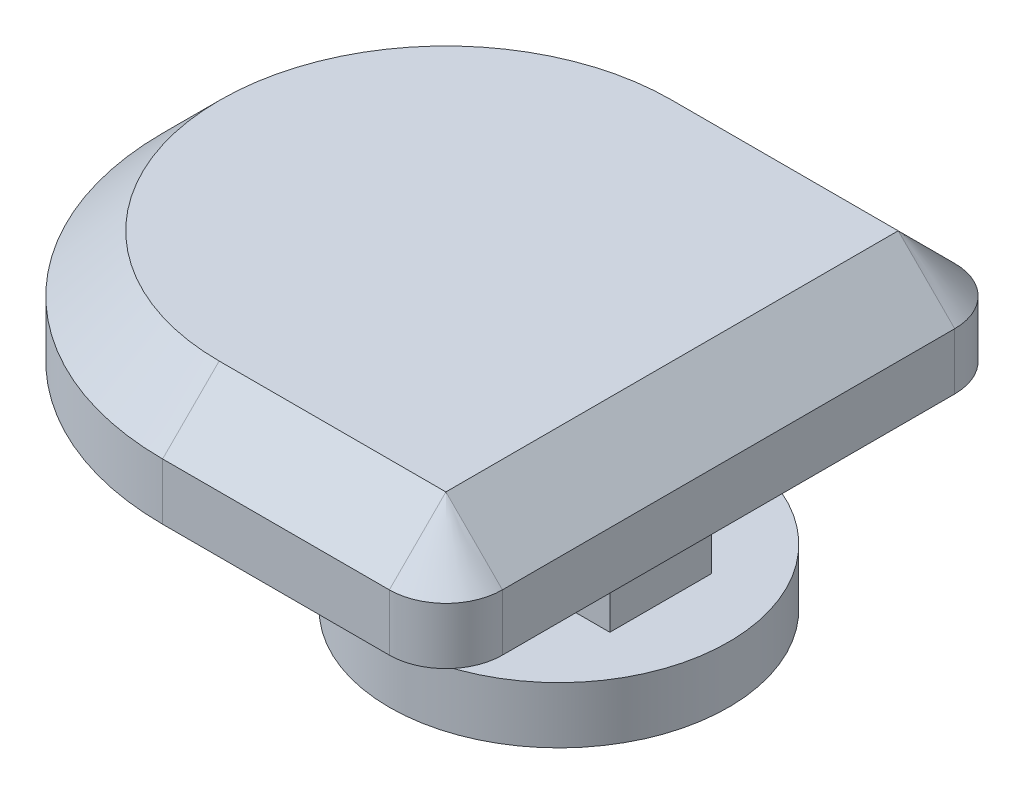
ISO-10303-21;
HEADER;
FILE_DESCRIPTION(('STEP AP214'),'2;1');
FILE_NAME('part.step','',(''),(''),'','','');
FILE_SCHEMA(('AUTOMOTIVE_DESIGN { 1 0 10303 214 1 1 1 1 }'));
ENDSEC;
DATA;
#1=APPLICATION_CONTEXT('core data for automotive mechanical design processes');
#2=APPLICATION_PROTOCOL_DEFINITION('international standard','automotive_design',2000,#1);
#3=PRODUCT_CONTEXT('',#1,'mechanical');
#4=PRODUCT('Part','Part','',(#3));
#5=PRODUCT_RELATED_PRODUCT_CATEGORY('part','',(#4));
#6=PRODUCT_DEFINITION_FORMATION('','',#4);
#7=PRODUCT_DEFINITION_CONTEXT('part definition',#1,'design');
#8=PRODUCT_DEFINITION('design','',#6,#7);
#9=PRODUCT_DEFINITION_SHAPE('','',#8);
#10=(LENGTH_UNIT() NAMED_UNIT(*) SI_UNIT(.MILLI.,.METRE.));
#11=(NAMED_UNIT(*) PLANE_ANGLE_UNIT() SI_UNIT($,.RADIAN.));
#12=(NAMED_UNIT(*) SI_UNIT($,.STERADIAN.) SOLID_ANGLE_UNIT());
#13=UNCERTAINTY_MEASURE_WITH_UNIT(LENGTH_MEASURE(1.E-05),#10,'distance_accuracy_value','');
#14=(GEOMETRIC_REPRESENTATION_CONTEXT(3) GLOBAL_UNCERTAINTY_ASSIGNED_CONTEXT((#13)) GLOBAL_UNIT_ASSIGNED_CONTEXT((#10,
#11,#12)) REPRESENTATION_CONTEXT('',''));
#15=CARTESIAN_POINT('',(0.,0.,0.));
#16=DIRECTION('',(0.,0.,1.));
#17=DIRECTION('',(1.,0.,0.));
#18=AXIS2_PLACEMENT_3D('',#15,#16,#17);
#19=CARTESIAN_POINT('',(0.,1.,0.));
#20=DIRECTION('',(0.,-1.,0.));
#21=DIRECTION('',(0.,0.,-1.));
#22=AXIS2_PLACEMENT_3D('',#19,#20,#21);
#23=CYLINDRICAL_SURFACE('',#22,3.);
#24=CARTESIAN_POINT('',(0.,1.,0.));
#25=DIRECTION('',(0.,1.,0.));
#26=DIRECTION('',(0.,0.,1.));
#27=AXIS2_PLACEMENT_3D('',#24,#25,#26);
#28=CIRCLE('',#27,3.);
#29=CARTESIAN_POINT('',(0.,1.,3.));
#30=VERTEX_POINT('',#29);
#31=EDGE_CURVE('E266',#30,#30,#28,.T.);
#32=ORIENTED_EDGE('',*,*,#31,.F.);
#33=EDGE_LOOP('',(#32));
#34=FACE_BOUND('',#33,.T.);
#35=CARTESIAN_POINT('',(0.,0.,0.));
#36=DIRECTION('',(0.,1.,0.));
#37=DIRECTION('',(0.,0.,1.));
#38=AXIS2_PLACEMENT_3D('',#35,#36,#37);
#39=CIRCLE('',#38,3.);
#40=CARTESIAN_POINT('',(0.,0.,3.));
#41=VERTEX_POINT('',#40);
#42=EDGE_CURVE('E265',#41,#41,#39,.T.);
#43=ORIENTED_EDGE('',*,*,#42,.T.);
#44=EDGE_LOOP('',(#43));
#45=FACE_BOUND('',#44,.T.);
#46=ADVANCED_FACE('F41',(#34,#45),#23,.T.);
#47=CARTESIAN_POINT('',(0.,1.,0.));
#48=DIRECTION('',(0.,1.,0.));
#49=DIRECTION('',(0.,0.,1.));
#50=AXIS2_PLACEMENT_3D('',#47,#48,#49);
#51=PLANE('',#50);
#52=DIRECTION('',(0.,0.,-1.));
#53=VECTOR('',#52,1.);
#54=CARTESIAN_POINT('',(1.8,1.,-0.9));
#55=LINE('',#54,#53);
#56=CARTESIAN_POINT('',(1.8,1.,0.9));
#57=VERTEX_POINT('',#56);
#58=CARTESIAN_POINT('',(1.8,1.,-0.9));
#59=VERTEX_POINT('',#58);
#60=EDGE_CURVE('E155',#57,#59,#55,.T.);
#61=ORIENTED_EDGE('',*,*,#60,.F.);
#62=DIRECTION('',(1.,0.,0.));
#63=VECTOR('',#62,1.);
#64=CARTESIAN_POINT('',(-1.8,1.,0.9));
#65=LINE('',#64,#63);
#66=CARTESIAN_POINT('',(-1.8,1.,0.9));
#67=VERTEX_POINT('',#66);
#68=EDGE_CURVE('E223',#67,#57,#65,.T.);
#69=ORIENTED_EDGE('',*,*,#68,.F.);
#70=DIRECTION('',(0.,0.,1.));
#71=VECTOR('',#70,1.);
#72=CARTESIAN_POINT('',(-1.8,1.,-0.9));
#73=LINE('',#72,#71);
#74=CARTESIAN_POINT('',(-1.8,1.,-0.9));
#75=VERTEX_POINT('',#74);
#76=EDGE_CURVE('E243',#75,#67,#73,.T.);
#77=ORIENTED_EDGE('',*,*,#76,.F.);
#78=DIRECTION('',(-1.,0.,0.));
#79=VECTOR('',#78,1.);
#80=CARTESIAN_POINT('',(-1.8,1.,-0.9));
#81=LINE('',#80,#79);
#82=EDGE_CURVE('E239',#59,#75,#81,.T.);
#83=ORIENTED_EDGE('',*,*,#82,.F.);
#84=EDGE_LOOP('',(#61,#69,#77,#83));
#85=FACE_BOUND('',#84,.T.);
#86=ORIENTED_EDGE('',*,*,#31,.T.);
#87=EDGE_LOOP('',(#86));
#88=FACE_BOUND('',#87,.T.);
#89=ADVANCED_FACE('F378',(#85,#88),#51,.T.);
#90=CARTESIAN_POINT('',(0.,0.,0.));
#91=DIRECTION('',(0.,1.,0.));
#92=DIRECTION('',(0.,0.,1.));
#93=AXIS2_PLACEMENT_3D('',#90,#91,#92);
#94=PLANE('',#93);
#95=ORIENTED_EDGE('',*,*,#42,.F.);
#96=EDGE_LOOP('',(#95));
#97=FACE_BOUND('',#96,.T.);
#98=ADVANCED_FACE('F384',(#97),#94,.F.);
#99=CARTESIAN_POINT('',(1.8,2.8,-0.9));
#100=DIRECTION('',(-1.,0.,0.));
#101=DIRECTION('',(0.,0.,1.));
#102=AXIS2_PLACEMENT_3D('',#99,#100,#101);
#103=PLANE('',#102);
#104=ORIENTED_EDGE('',*,*,#60,.T.);
#105=DIRECTION('',(0.,-1.,0.));
#106=VECTOR('',#105,1.);
#107=CARTESIAN_POINT('',(1.8,2.8,-0.9));
#108=LINE('',#107,#106);
#109=CARTESIAN_POINT('',(1.8,2.8,-0.9));
#110=VERTEX_POINT('',#109);
#111=EDGE_CURVE('E261',#110,#59,#108,.T.);
#112=ORIENTED_EDGE('',*,*,#111,.F.);
#113=DIRECTION('',(0.,0.,-1.));
#114=VECTOR('',#113,1.);
#115=CARTESIAN_POINT('',(1.8,2.8,-0.9));
#116=LINE('',#115,#114);
#117=CARTESIAN_POINT('',(1.8,2.8,0.9));
#118=VERTEX_POINT('',#117);
#119=EDGE_CURVE('E218',#118,#110,#116,.T.);
#120=ORIENTED_EDGE('',*,*,#119,.F.);
#121=DIRECTION('',(0.,-1.,0.));
#122=VECTOR('',#121,1.);
#123=CARTESIAN_POINT('',(1.8,2.8,0.9));
#124=LINE('',#123,#122);
#125=EDGE_CURVE('E235',#118,#57,#124,.T.);
#126=ORIENTED_EDGE('',*,*,#125,.T.);
#127=EDGE_LOOP('',(#104,#112,#120,#126));
#128=FACE_BOUND('',#127,.T.);
#129=ADVANCED_FACE('F475',(#128),#103,.F.);
#130=CARTESIAN_POINT('',(-1.8,2.8,-0.9));
#131=DIRECTION('',(0.,0.,1.));
#132=DIRECTION('',(1.,0.,0.));
#133=AXIS2_PLACEMENT_3D('',#130,#131,#132);
#134=PLANE('',#133);
#135=ORIENTED_EDGE('',*,*,#82,.T.);
#136=DIRECTION('',(0.,-1.,0.));
#137=VECTOR('',#136,1.);
#138=CARTESIAN_POINT('',(-1.8,2.8,-0.9));
#139=LINE('',#138,#137);
#140=CARTESIAN_POINT('',(-1.8,2.8,-0.9));
#141=VERTEX_POINT('',#140);
#142=EDGE_CURVE('E257',#141,#75,#139,.T.);
#143=ORIENTED_EDGE('',*,*,#142,.F.);
#144=DIRECTION('',(-1.,0.,0.));
#145=VECTOR('',#144,1.);
#146=CARTESIAN_POINT('',(-1.8,2.8,-0.9));
#147=LINE('',#146,#145);
#148=EDGE_CURVE('E222',#110,#141,#147,.T.);
#149=ORIENTED_EDGE('',*,*,#148,.F.);
#150=ORIENTED_EDGE('',*,*,#111,.T.);
#151=EDGE_LOOP('',(#135,#143,#149,#150));
#152=FACE_BOUND('',#151,.T.);
#153=ADVANCED_FACE('F471',(#152),#134,.F.);
#154=CARTESIAN_POINT('',(-1.8,2.8,-0.9));
#155=DIRECTION('',(1.,0.,0.));
#156=DIRECTION('',(0.,0.,-1.));
#157=AXIS2_PLACEMENT_3D('',#154,#155,#156);
#158=PLANE('',#157);
#159=ORIENTED_EDGE('',*,*,#76,.T.);
#160=DIRECTION('',(0.,-1.,0.));
#161=VECTOR('',#160,1.);
#162=CARTESIAN_POINT('',(-1.8,2.8,0.9));
#163=LINE('',#162,#161);
#164=CARTESIAN_POINT('',(-1.8,2.8,0.9));
#165=VERTEX_POINT('',#164);
#166=EDGE_CURVE('E253',#165,#67,#163,.T.);
#167=ORIENTED_EDGE('',*,*,#166,.F.);
#168=DIRECTION('',(0.,0.,1.));
#169=VECTOR('',#168,1.);
#170=CARTESIAN_POINT('',(-1.8,2.8,-0.9));
#171=LINE('',#170,#169);
#172=EDGE_CURVE('E227',#141,#165,#171,.T.);
#173=ORIENTED_EDGE('',*,*,#172,.F.);
#174=ORIENTED_EDGE('',*,*,#142,.T.);
#175=EDGE_LOOP('',(#159,#167,#173,#174));
#176=FACE_BOUND('',#175,.T.);
#177=ADVANCED_FACE('F467',(#176),#158,.F.);
#178=CARTESIAN_POINT('',(-1.8,2.8,0.9));
#179=DIRECTION('',(0.,0.,-1.));
#180=DIRECTION('',(-1.,0.,0.));
#181=AXIS2_PLACEMENT_3D('',#178,#179,#180);
#182=PLANE('',#181);
#183=ORIENTED_EDGE('',*,*,#68,.T.);
#184=ORIENTED_EDGE('',*,*,#125,.F.);
#185=DIRECTION('',(1.,0.,0.));
#186=VECTOR('',#185,1.);
#187=CARTESIAN_POINT('',(-1.8,2.8,0.9));
#188=LINE('',#187,#186);
#189=EDGE_CURVE('E231',#165,#118,#188,.T.);
#190=ORIENTED_EDGE('',*,*,#189,.F.);
#191=ORIENTED_EDGE('',*,*,#166,.T.);
#192=EDGE_LOOP('',(#183,#184,#190,#191));
#193=FACE_BOUND('',#192,.T.);
#194=ADVANCED_FACE('F464',(#193),#182,.F.);
#195=CARTESIAN_POINT('',(-2.01,2.8,0.0100000000000005));
#196=DIRECTION('',(0.,1.,0.));
#197=DIRECTION('',(0.,0.,1.));
#198=AXIS2_PLACEMENT_3D('',#195,#196,#197);
#199=PLANE('',#198);
#200=CARTESIAN_POINT('',(-2.01,2.8,0.0100000000000005));
#201=DIRECTION('',(0.,1.,0.));
#202=DIRECTION('',(0.,0.,1.));
#203=AXIS2_PLACEMENT_3D('',#200,#201,#202);
#204=CIRCLE('',#203,4.99);
#205=CARTESIAN_POINT('',(-7.,2.8,0.0099999999999649));
#206=VERTEX_POINT('',#205);
#207=CARTESIAN_POINT('',(-2.00999999999996,2.8,5.));
#208=VERTEX_POINT('',#207);
#209=EDGE_CURVE('E163',#206,#208,#204,.T.);
#210=ORIENTED_EDGE('',*,*,#209,.F.);
#211=DIRECTION('',(0.,0.,1.));
#212=VECTOR('',#211,1.);
#213=CARTESIAN_POINT('',(-7.,2.8,-0.00999999999995796));
#214=LINE('',#213,#212);
#215=CARTESIAN_POINT('',(-7.,2.8,-0.00999999999995796));
#216=VERTEX_POINT('',#215);
#217=EDGE_CURVE('E196',#216,#206,#214,.T.);
#218=ORIENTED_EDGE('',*,*,#217,.F.);
#219=CARTESIAN_POINT('',(-2.01,2.8,-0.00999999999999699));
#220=DIRECTION('',(0.,1.,0.));
#221=DIRECTION('',(0.,0.,1.));
#222=AXIS2_PLACEMENT_3D('',#219,#220,#221);
#223=CIRCLE('',#222,4.99);
#224=CARTESIAN_POINT('',(-2.00999999999997,2.8,-5.));
#225=VERTEX_POINT('',#224);
#226=EDGE_CURVE('E192',#225,#216,#223,.T.);
#227=ORIENTED_EDGE('',*,*,#226,.F.);
#228=DIRECTION('',(-1.,0.,0.));
#229=VECTOR('',#228,1.);
#230=CARTESIAN_POINT('',(1.99999999999999,2.8,-5.));
#231=LINE('',#230,#229);
#232=CARTESIAN_POINT('',(1.99999999999999,2.8,-5.));
#233=VERTEX_POINT('',#232);
#234=EDGE_CURVE('E188',#233,#225,#231,.T.);
#235=ORIENTED_EDGE('',*,*,#234,.F.);
#236=CARTESIAN_POINT('',(2.,2.8,-4.));
#237=DIRECTION('',(0.,1.,0.));
#238=DIRECTION('',(0.,0.,1.));
#239=AXIS2_PLACEMENT_3D('',#236,#237,#238);
#240=CIRCLE('',#239,1.);
#241=CARTESIAN_POINT('',(3.,2.8,-3.99999999999999));
#242=VERTEX_POINT('',#241);
#243=EDGE_CURVE('E184',#242,#233,#240,.T.);
#244=ORIENTED_EDGE('',*,*,#243,.F.);
#245=DIRECTION('',(0.,0.,-1.));
#246=VECTOR('',#245,1.);
#247=CARTESIAN_POINT('',(3.,2.8,-3.99999999999999));
#248=LINE('',#247,#246);
#249=CARTESIAN_POINT('',(3.,2.8,3.99999999999999));
#250=VERTEX_POINT('',#249);
#251=EDGE_CURVE('E180',#250,#242,#248,.T.);
#252=ORIENTED_EDGE('',*,*,#251,.F.);
#253=CARTESIAN_POINT('',(2.,2.8,4.));
#254=DIRECTION('',(0.,1.,0.));
#255=DIRECTION('',(0.,0.,-1.));
#256=AXIS2_PLACEMENT_3D('',#253,#254,#255);
#257=CIRCLE('',#256,1.);
#258=CARTESIAN_POINT('',(1.99999999999999,2.8,5.));
#259=VERTEX_POINT('',#258);
#260=EDGE_CURVE('E166',#259,#250,#257,.T.);
#261=ORIENTED_EDGE('',*,*,#260,.F.);
#262=DIRECTION('',(1.,0.,0.));
#263=VECTOR('',#262,1.);
#264=CARTESIAN_POINT('',(1.99999999999999,2.8,5.));
#265=LINE('',#264,#263);
#266=EDGE_CURVE('E151',#208,#259,#265,.T.);
#267=ORIENTED_EDGE('',*,*,#266,.F.);
#268=EDGE_LOOP('',(#210,#218,#227,#235,#244,#252,#261,#267));
#269=FACE_BOUND('',#268,.T.);
#270=ORIENTED_EDGE('',*,*,#189,.T.);
#271=ORIENTED_EDGE('',*,*,#119,.T.);
#272=ORIENTED_EDGE('',*,*,#148,.T.);
#273=ORIENTED_EDGE('',*,*,#172,.T.);
#274=EDGE_LOOP('',(#270,#271,#272,#273));
#275=FACE_BOUND('',#274,.T.);
#276=ADVANCED_FACE('F160',(#269,#275),#199,.F.);
#277=CARTESIAN_POINT('',(-2.01,4.8,0.0100000000000005));
#278=DIRECTION('',(0.,-1.,0.));
#279=DIRECTION('',(0.,0.,-1.));
#280=AXIS2_PLACEMENT_3D('',#277,#278,#279);
#281=CYLINDRICAL_SURFACE('',#280,4.99);
#282=DIRECTION('',(0.,-1.,0.));
#283=VECTOR('',#282,1.);
#284=CARTESIAN_POINT('',(-2.00999999999996,4.8,5.));
#285=LINE('',#284,#283);
#286=CARTESIAN_POINT('',(-2.00999999999996,3.79999999999999,5.));
#287=VERTEX_POINT('',#286);
#288=EDGE_CURVE('E148',#287,#208,#285,.T.);
#289=ORIENTED_EDGE('',*,*,#288,.F.);
#290=CARTESIAN_POINT('',(-2.01,3.79999999999999,0.0100000000000005));
#291=DIRECTION('',(0.,1.,0.));
#292=DIRECTION('',(0.,0.,1.));
#293=AXIS2_PLACEMENT_3D('',#290,#291,#292);
#294=CIRCLE('',#293,4.99);
#295=CARTESIAN_POINT('',(-7.,3.79999999999999,0.0099999999999649));
#296=VERTEX_POINT('',#295);
#297=EDGE_CURVE('E11',#287,#296,#294,.F.);
#298=ORIENTED_EDGE('',*,*,#297,.T.);
#299=DIRECTION('',(0.,-1.,0.));
#300=VECTOR('',#299,1.);
#301=CARTESIAN_POINT('',(-7.,4.8,0.0099999999999649));
#302=LINE('',#301,#300);
#303=EDGE_CURVE('E170',#296,#206,#302,.T.);
#304=ORIENTED_EDGE('',*,*,#303,.T.);
#305=ORIENTED_EDGE('',*,*,#209,.T.);
#306=EDGE_LOOP('',(#289,#298,#304,#305));
#307=FACE_BOUND('',#306,.T.);
#308=ADVANCED_FACE('F169',(#307),#281,.T.);
#309=CARTESIAN_POINT('',(1.99999999999999,4.8,5.));
#310=DIRECTION('',(0.,0.,-1.));
#311=DIRECTION('',(-1.,0.,0.));
#312=AXIS2_PLACEMENT_3D('',#309,#310,#311);
#313=PLANE('',#312);
#314=DIRECTION('',(0.,-1.,0.));
#315=VECTOR('',#314,1.);
#316=CARTESIAN_POINT('',(1.99999999999999,4.8,5.));
#317=LINE('',#316,#315);
#318=CARTESIAN_POINT('',(1.99999999999999,3.79999999999999,5.));
#319=VERTEX_POINT('',#318);
#320=EDGE_CURVE('E156',#319,#259,#317,.T.);
#321=ORIENTED_EDGE('',*,*,#320,.F.);
#322=DIRECTION('',(-1.,0.,0.));
#323=VECTOR('',#322,1.);
#324=CARTESIAN_POINT('',(-2.00999999999996,3.79999999999999,5.));
#325=LINE('',#324,#323);
#326=EDGE_CURVE('E52',#319,#287,#325,.T.);
#327=ORIENTED_EDGE('',*,*,#326,.T.);
#328=ORIENTED_EDGE('',*,*,#288,.T.);
#329=ORIENTED_EDGE('',*,*,#266,.T.);
#330=EDGE_LOOP('',(#321,#327,#328,#329));
#331=FACE_BOUND('',#330,.T.);
#332=ADVANCED_FACE('F150',(#331),#313,.F.);
#333=CARTESIAN_POINT('',(2.,4.8,4.));
#334=DIRECTION('',(0.,-1.,0.));
#335=DIRECTION('',(0.,0.,-1.));
#336=AXIS2_PLACEMENT_3D('',#333,#334,#335);
#337=CYLINDRICAL_SURFACE('',#336,1.);
#338=DIRECTION('',(0.,-1.,0.));
#339=VECTOR('',#338,1.);
#340=CARTESIAN_POINT('',(3.,4.8,3.99999999999999));
#341=LINE('',#340,#339);
#342=CARTESIAN_POINT('',(3.,3.79999999999999,3.99999999999999));
#343=VERTEX_POINT('',#342);
#344=EDGE_CURVE('E213',#343,#250,#341,.T.);
#345=ORIENTED_EDGE('',*,*,#344,.F.);
#346=CARTESIAN_POINT('',(2.,3.79999999999999,4.));
#347=DIRECTION('',(0.,1.,0.));
#348=DIRECTION('',(0.,0.,1.));
#349=AXIS2_PLACEMENT_3D('',#346,#347,#348);
#350=CIRCLE('',#349,1.);
#351=EDGE_CURVE('E305',#343,#319,#350,.F.);
#352=ORIENTED_EDGE('',*,*,#351,.T.);
#353=ORIENTED_EDGE('',*,*,#320,.T.);
#354=ORIENTED_EDGE('',*,*,#260,.T.);
#355=EDGE_LOOP('',(#345,#352,#353,#354));
#356=FACE_BOUND('',#355,.T.);
#357=ADVANCED_FACE('F451',(#356),#337,.T.);
#358=CARTESIAN_POINT('',(3.,4.8,-3.99999999999999));
#359=DIRECTION('',(-1.,0.,0.));
#360=DIRECTION('',(0.,0.,1.));
#361=AXIS2_PLACEMENT_3D('',#358,#359,#360);
#362=PLANE('',#361);
#363=DIRECTION('',(0.,-1.,0.));
#364=VECTOR('',#363,1.);
#365=CARTESIAN_POINT('',(3.,4.8,-3.99999999999999));
#366=LINE('',#365,#364);
#367=CARTESIAN_POINT('',(3.,3.79999999999999,-3.99999999999999));
#368=VERTEX_POINT('',#367);
#369=EDGE_CURVE('E210',#368,#242,#366,.T.);
#370=ORIENTED_EDGE('',*,*,#369,.F.);
#371=DIRECTION('',(0.,0.,1.));
#372=VECTOR('',#371,1.);
#373=CARTESIAN_POINT('',(3.,3.79999999999999,3.99999999999999));
#374=LINE('',#373,#372);
#375=EDGE_CURVE('E299',#368,#343,#374,.T.);
#376=ORIENTED_EDGE('',*,*,#375,.T.);
#377=ORIENTED_EDGE('',*,*,#344,.T.);
#378=ORIENTED_EDGE('',*,*,#251,.T.);
#379=EDGE_LOOP('',(#370,#376,#377,#378));
#380=FACE_BOUND('',#379,.T.);
#381=ADVANCED_FACE('F448',(#380),#362,.F.);
#382=CARTESIAN_POINT('',(2.,4.8,-4.));
#383=DIRECTION('',(0.,-1.,0.));
#384=DIRECTION('',(0.,0.,-1.));
#385=AXIS2_PLACEMENT_3D('',#382,#383,#384);
#386=CYLINDRICAL_SURFACE('',#385,1.);
#387=DIRECTION('',(0.,-1.,0.));
#388=VECTOR('',#387,1.);
#389=CARTESIAN_POINT('',(1.99999999999999,4.8,-5.));
#390=LINE('',#389,#388);
#391=CARTESIAN_POINT('',(1.99999999999999,3.79999999999999,-5.));
#392=VERTEX_POINT('',#391);
#393=EDGE_CURVE('E207',#392,#233,#390,.T.);
#394=ORIENTED_EDGE('',*,*,#393,.F.);
#395=CARTESIAN_POINT('',(2.,3.79999999999999,-4.));
#396=DIRECTION('',(0.,1.,0.));
#397=DIRECTION('',(0.,0.,1.));
#398=AXIS2_PLACEMENT_3D('',#395,#396,#397);
#399=CIRCLE('',#398,1.);
#400=EDGE_CURVE('E270',#392,#368,#399,.F.);
#401=ORIENTED_EDGE('',*,*,#400,.T.);
#402=ORIENTED_EDGE('',*,*,#369,.T.);
#403=ORIENTED_EDGE('',*,*,#243,.T.);
#404=EDGE_LOOP('',(#394,#401,#402,#403));
#405=FACE_BOUND('',#404,.T.);
#406=ADVANCED_FACE('F446',(#405),#386,.T.);
#407=CARTESIAN_POINT('',(1.99999999999999,4.8,-5.));
#408=DIRECTION('',(0.,0.,1.));
#409=DIRECTION('',(1.,0.,0.));
#410=AXIS2_PLACEMENT_3D('',#407,#408,#409);
#411=PLANE('',#410);
#412=DIRECTION('',(0.,-1.,0.));
#413=VECTOR('',#412,1.);
#414=CARTESIAN_POINT('',(-2.00999999999997,4.8,-5.));
#415=LINE('',#414,#413);
#416=CARTESIAN_POINT('',(-2.00999999999997,3.79999999999999,-5.));
#417=VERTEX_POINT('',#416);
#418=EDGE_CURVE('E204',#417,#225,#415,.T.);
#419=ORIENTED_EDGE('',*,*,#418,.F.);
#420=DIRECTION('',(1.,0.,0.));
#421=VECTOR('',#420,1.);
#422=CARTESIAN_POINT('',(1.99999999999999,3.79999999999999,-5.));
#423=LINE('',#422,#421);
#424=EDGE_CURVE('E296',#417,#392,#423,.T.);
#425=ORIENTED_EDGE('',*,*,#424,.T.);
#426=ORIENTED_EDGE('',*,*,#393,.T.);
#427=ORIENTED_EDGE('',*,*,#234,.T.);
#428=EDGE_LOOP('',(#419,#425,#426,#427));
#429=FACE_BOUND('',#428,.T.);
#430=ADVANCED_FACE('F361',(#429),#411,.F.);
#431=CARTESIAN_POINT('',(-2.01,4.8,-0.00999999999999699));
#432=DIRECTION('',(0.,-1.,0.));
#433=DIRECTION('',(0.,0.,-1.));
#434=AXIS2_PLACEMENT_3D('',#431,#432,#433);
#435=CYLINDRICAL_SURFACE('',#434,4.99);
#436=DIRECTION('',(0.,-1.,0.));
#437=VECTOR('',#436,1.);
#438=CARTESIAN_POINT('',(-7.,4.8,-0.00999999999995796));
#439=LINE('',#438,#437);
#440=CARTESIAN_POINT('',(-7.,3.79999999999999,-0.00999999999995796));
#441=VERTEX_POINT('',#440);
#442=EDGE_CURVE('E201',#441,#216,#439,.T.);
#443=ORIENTED_EDGE('',*,*,#442,.F.);
#444=CARTESIAN_POINT('',(-2.01,3.79999999999999,-0.00999999999999699));
#445=DIRECTION('',(0.,1.,0.));
#446=DIRECTION('',(0.,0.,1.));
#447=AXIS2_PLACEMENT_3D('',#444,#445,#446);
#448=CIRCLE('',#447,4.99);
#449=EDGE_CURVE('E302',#441,#417,#448,.F.);
#450=ORIENTED_EDGE('',*,*,#449,.T.);
#451=ORIENTED_EDGE('',*,*,#418,.T.);
#452=ORIENTED_EDGE('',*,*,#226,.T.);
#453=EDGE_LOOP('',(#443,#450,#451,#452));
#454=FACE_BOUND('',#453,.T.);
#455=ADVANCED_FACE('F359',(#454),#435,.T.);
#456=CARTESIAN_POINT('',(-7.,4.8,-0.00999999999995796));
#457=DIRECTION('',(1.,0.,0.));
#458=DIRECTION('',(0.,0.,-1.));
#459=AXIS2_PLACEMENT_3D('',#456,#457,#458);
#460=PLANE('',#459);
#461=ORIENTED_EDGE('',*,*,#303,.F.);
#462=DIRECTION('',(0.,0.,-1.));
#463=VECTOR('',#462,1.);
#464=CARTESIAN_POINT('',(-7.,3.79999999999999,-0.00999999999995796));
#465=LINE('',#464,#463);
#466=EDGE_CURVE('E308',#296,#441,#465,.T.);
#467=ORIENTED_EDGE('',*,*,#466,.T.);
#468=ORIENTED_EDGE('',*,*,#442,.T.);
#469=ORIENTED_EDGE('',*,*,#217,.T.);
#470=EDGE_LOOP('',(#461,#467,#468,#469));
#471=FACE_BOUND('',#470,.T.);
#472=ADVANCED_FACE('F367',(#471),#460,.F.);
#473=CARTESIAN_POINT('',(-2.01,4.8,0.0100000000000005));
#474=DIRECTION('',(0.,1.,0.));
#475=DIRECTION('',(0.,0.,1.));
#476=AXIS2_PLACEMENT_3D('',#473,#474,#475);
#477=PLANE('',#476);
#478=DIRECTION('',(0.,0.,-1.));
#479=VECTOR('',#478,1.);
#480=CARTESIAN_POINT('',(2.,4.8,-3.99999999999999));
#481=LINE('',#480,#479);
#482=CARTESIAN_POINT('',(2.,4.8,4.));
#483=VERTEX_POINT('',#482);
#484=CARTESIAN_POINT('',(2.,4.8,-4.));
#485=VERTEX_POINT('',#484);
#486=EDGE_CURVE('E289',#483,#485,#481,.T.);
#487=ORIENTED_EDGE('',*,*,#486,.T.);
#488=DIRECTION('',(-1.,0.,0.));
#489=VECTOR('',#488,1.);
#490=CARTESIAN_POINT('',(-2.00999999999997,4.8,-4.));
#491=LINE('',#490,#489);
#492=CARTESIAN_POINT('',(-2.00999999999997,4.8,-4.));
#493=VERTEX_POINT('',#492);
#494=EDGE_CURVE('E292',#485,#493,#491,.T.);
#495=ORIENTED_EDGE('',*,*,#494,.T.);
#496=CARTESIAN_POINT('',(-2.01,4.8,-0.00999999999999699));
#497=DIRECTION('',(0.,1.,0.));
#498=DIRECTION('',(0.,0.,1.));
#499=AXIS2_PLACEMENT_3D('',#496,#497,#498);
#500=CIRCLE('',#499,3.99);
#501=CARTESIAN_POINT('',(-6.,4.8,-0.00999999999996578));
#502=VERTEX_POINT('',#501);
#503=EDGE_CURVE('E286',#493,#502,#500,.T.);
#504=ORIENTED_EDGE('',*,*,#503,.T.);
#505=DIRECTION('',(0.,0.,1.));
#506=VECTOR('',#505,1.);
#507=CARTESIAN_POINT('',(-6.,4.8,0.0099999999999649));
#508=LINE('',#507,#506);
#509=CARTESIAN_POINT('',(-6.,4.8,0.0099999999999649));
#510=VERTEX_POINT('',#509);
#511=EDGE_CURVE('E283',#502,#510,#508,.T.);
#512=ORIENTED_EDGE('',*,*,#511,.T.);
#513=CARTESIAN_POINT('',(-2.01,4.8,0.0100000000000005));
#514=DIRECTION('',(0.,1.,0.));
#515=DIRECTION('',(0.,0.,1.));
#516=AXIS2_PLACEMENT_3D('',#513,#514,#515);
#517=CIRCLE('',#516,3.99);
#518=CARTESIAN_POINT('',(-2.00999999999996,4.8,4.));
#519=VERTEX_POINT('',#518);
#520=EDGE_CURVE('E277',#510,#519,#517,.T.);
#521=ORIENTED_EDGE('',*,*,#520,.T.);
#522=DIRECTION('',(1.,0.,0.));
#523=VECTOR('',#522,1.);
#524=CARTESIAN_POINT('',(1.99999999999999,4.8,4.));
#525=LINE('',#524,#523);
#526=EDGE_CURVE('E280',#519,#483,#525,.T.);
#527=ORIENTED_EDGE('',*,*,#526,.T.);
#528=EDGE_LOOP('',(#487,#495,#504,#512,#521,#527));
#529=FACE_BOUND('',#528,.T.);
#530=ADVANCED_FACE('F347',(#529),#477,.T.);
#531=CARTESIAN_POINT('',(-2.01,4.8,0.0100000000000005));
#532=DIRECTION('',(0.,-1.,0.));
#533=DIRECTION('',(0.,0.,-1.));
#534=AXIS2_PLACEMENT_3D('',#531,#532,#533);
#535=CONICAL_SURFACE('',#534,3.99,0.785398163397445);
#536=DIRECTION('',(0.707106781186545,0.70710678118655,0.));
#537=VECTOR('',#536,1.);
#538=CARTESIAN_POINT('',(-7.,3.79999999999999,0.0099999999999649));
#539=LINE('',#538,#537);
#540=EDGE_CURVE('E176',#296,#510,#539,.T.);
#541=ORIENTED_EDGE('',*,*,#540,.F.);
#542=ORIENTED_EDGE('',*,*,#297,.F.);
#543=DIRECTION('',(0.,-0.70710678118655,0.707106781186545));
#544=VECTOR('',#543,1.);
#545=CARTESIAN_POINT('',(-2.00999999999996,4.8,4.));
#546=LINE('',#545,#544);
#547=EDGE_CURVE('E46',#519,#287,#546,.T.);
#548=ORIENTED_EDGE('',*,*,#547,.F.);
#549=ORIENTED_EDGE('',*,*,#520,.F.);
#550=EDGE_LOOP('',(#541,#542,#548,#549));
#551=FACE_BOUND('',#550,.T.);
#552=ADVANCED_FACE('F44',(#551),#535,.T.);
#553=CARTESIAN_POINT('',(-2.01,4.8,4.));
#554=DIRECTION('',(0.,0.707106781186545,0.70710678118655));
#555=DIRECTION('',(-1.,0.,0.));
#556=AXIS2_PLACEMENT_3D('',#553,#554,#555);
#557=PLANE('',#556);
#558=ORIENTED_EDGE('',*,*,#547,.T.);
#559=ORIENTED_EDGE('',*,*,#326,.F.);
#560=DIRECTION('',(0.,-0.70710678118655,0.707106781186545));
#561=VECTOR('',#560,1.);
#562=CARTESIAN_POINT('',(2.,4.8,4.));
#563=LINE('',#562,#561);
#564=EDGE_CURVE('E331',#483,#319,#563,.T.);
#565=ORIENTED_EDGE('',*,*,#564,.F.);
#566=ORIENTED_EDGE('',*,*,#526,.F.);
#567=EDGE_LOOP('',(#558,#559,#565,#566));
#568=FACE_BOUND('',#567,.T.);
#569=ADVANCED_FACE('F429',(#568),#557,.T.);
#570=CARTESIAN_POINT('',(-6.,4.8,0.0100000000000005));
#571=DIRECTION('',(-0.70710678118655,0.707106781186545,0.));
#572=DIRECTION('',(0.,0.,-1.));
#573=AXIS2_PLACEMENT_3D('',#570,#571,#572);
#574=PLANE('',#573);
#575=ORIENTED_EDGE('',*,*,#540,.T.);
#576=ORIENTED_EDGE('',*,*,#511,.F.);
#577=DIRECTION('',(0.707106781186545,0.70710678118655,0.));
#578=VECTOR('',#577,1.);
#579=CARTESIAN_POINT('',(-7.,3.79999999999999,-0.00999999999995796));
#580=LINE('',#579,#578);
#581=EDGE_CURVE('E327',#441,#502,#580,.T.);
#582=ORIENTED_EDGE('',*,*,#581,.F.);
#583=ORIENTED_EDGE('',*,*,#466,.F.);
#584=EDGE_LOOP('',(#575,#576,#582,#583));
#585=FACE_BOUND('',#584,.T.);
#586=ADVANCED_FACE('F340',(#585),#574,.T.);
#587=CARTESIAN_POINT('',(2.,3.79999999999999,4.));
#588=DIRECTION('',(0.,-1.,0.));
#589=DIRECTION('',(0.,0.,-1.));
#590=AXIS2_PLACEMENT_3D('',#587,#588,#589);
#591=CONICAL_SURFACE('',#590,1.,0.785398163397445);
#592=ORIENTED_EDGE('',*,*,#564,.T.);
#593=ORIENTED_EDGE('',*,*,#351,.F.);
#594=DIRECTION('',(0.707106781186546,-0.70710678118655,0.));
#595=VECTOR('',#594,1.);
#596=CARTESIAN_POINT('',(2.,4.8,3.99999999999999));
#597=LINE('',#596,#595);
#598=EDGE_CURVE('E323',#483,#343,#597,.T.);
#599=ORIENTED_EDGE('',*,*,#598,.F.);
#600=EDGE_LOOP('',(#592,#593,#599));
#601=FACE_BOUND('',#600,.T.);
#602=ADVANCED_FACE('F418',(#601),#591,.T.);
#603=CARTESIAN_POINT('',(-2.01,4.8,-0.00999999999999699));
#604=DIRECTION('',(0.,-1.,0.));
#605=DIRECTION('',(0.,0.,-1.));
#606=AXIS2_PLACEMENT_3D('',#603,#604,#605);
#607=CONICAL_SURFACE('',#606,3.99,0.785398163397445);
#608=ORIENTED_EDGE('',*,*,#581,.T.);
#609=ORIENTED_EDGE('',*,*,#503,.F.);
#610=DIRECTION('',(0.,0.70710678118655,0.707106781186545));
#611=VECTOR('',#610,1.);
#612=CARTESIAN_POINT('',(-2.00999999999997,3.79999999999999,-5.));
#613=LINE('',#612,#611);
#614=EDGE_CURVE('E320',#417,#493,#613,.T.);
#615=ORIENTED_EDGE('',*,*,#614,.F.);
#616=ORIENTED_EDGE('',*,*,#449,.F.);
#617=EDGE_LOOP('',(#608,#609,#615,#616));
#618=FACE_BOUND('',#617,.T.);
#619=ADVANCED_FACE('F353',(#618),#607,.T.);
#620=CARTESIAN_POINT('',(2.,4.8,0.00999999999999937));
#621=DIRECTION('',(0.70710678118655,0.707106781186545,0.));
#622=DIRECTION('',(0.,0.,1.));
#623=AXIS2_PLACEMENT_3D('',#620,#621,#622);
#624=PLANE('',#623);
#625=ORIENTED_EDGE('',*,*,#598,.T.);
#626=ORIENTED_EDGE('',*,*,#375,.F.);
#627=DIRECTION('',(0.707106781186546,-0.70710678118655,0.));
#628=VECTOR('',#627,1.);
#629=CARTESIAN_POINT('',(2.,4.8,-4.));
#630=LINE('',#629,#628);
#631=EDGE_CURVE('E317',#485,#368,#630,.T.);
#632=ORIENTED_EDGE('',*,*,#631,.F.);
#633=ORIENTED_EDGE('',*,*,#486,.F.);
#634=EDGE_LOOP('',(#625,#626,#632,#633));
#635=FACE_BOUND('',#634,.T.);
#636=ADVANCED_FACE('F405',(#635),#624,.T.);
#637=CARTESIAN_POINT('',(-2.01,4.8,-4.));
#638=DIRECTION('',(0.,0.707106781186545,-0.70710678118655));
#639=DIRECTION('',(1.,0.,0.));
#640=AXIS2_PLACEMENT_3D('',#637,#638,#639);
#641=PLANE('',#640);
#642=ORIENTED_EDGE('',*,*,#614,.T.);
#643=ORIENTED_EDGE('',*,*,#494,.F.);
#644=DIRECTION('',(0.,0.70710678118655,0.707106781186545));
#645=VECTOR('',#644,1.);
#646=CARTESIAN_POINT('',(1.99999999999999,3.79999999999999,-5.));
#647=LINE('',#646,#645);
#648=EDGE_CURVE('E313',#392,#485,#647,.T.);
#649=ORIENTED_EDGE('',*,*,#648,.F.);
#650=ORIENTED_EDGE('',*,*,#424,.F.);
#651=EDGE_LOOP('',(#642,#643,#649,#650));
#652=FACE_BOUND('',#651,.T.);
#653=ADVANCED_FACE('F398',(#652),#641,.T.);
#654=CARTESIAN_POINT('',(2.,3.79999999999999,-4.));
#655=DIRECTION('',(0.,-1.,0.));
#656=DIRECTION('',(0.,0.,-1.));
#657=AXIS2_PLACEMENT_3D('',#654,#655,#656);
#658=CONICAL_SURFACE('',#657,1.,0.785398163397445);
#659=ORIENTED_EDGE('',*,*,#631,.T.);
#660=ORIENTED_EDGE('',*,*,#400,.F.);
#661=ORIENTED_EDGE('',*,*,#648,.T.);
#662=EDGE_LOOP('',(#659,#660,#661));
#663=FACE_BOUND('',#662,.T.);
#664=ADVANCED_FACE('F392',(#663),#658,.T.);
#665=CLOSED_SHELL('',(#46,#89,#98,#129,#153,#177,#194,#276,#308,#332,#357,#381,#406,#430,#455,
#472,#530,#552,#569,#586,#602,#619,#636,#653,#664));
#666=MANIFOLD_SOLID_BREP('B2',#665);
#667=ADVANCED_BREP_SHAPE_REPRESENTATION('',(#18,#666),#14);
#668=SHAPE_DEFINITION_REPRESENTATION(#9,#667);
ENDSEC;
END-ISO-10303-21;
